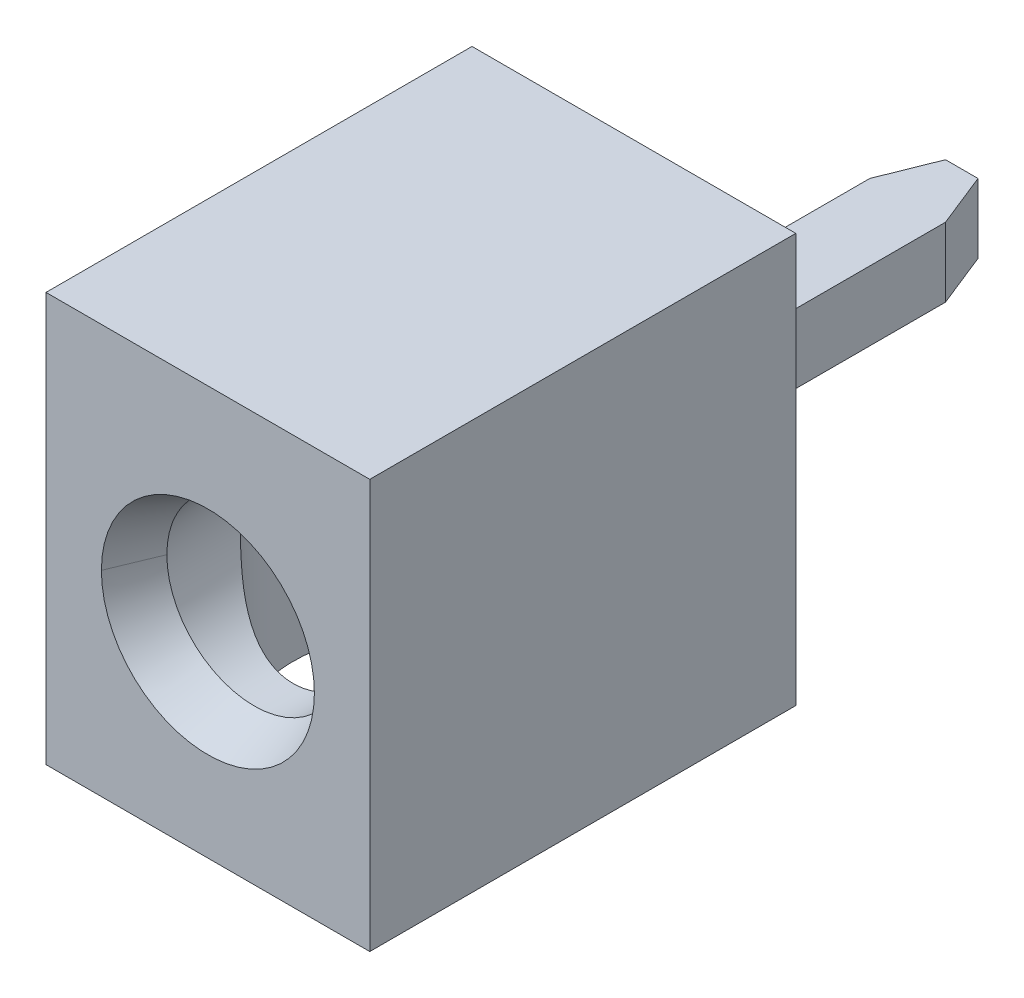
ISO-10303-21;
HEADER;
FILE_DESCRIPTION(('STEP AP214'),'2;1');
FILE_NAME('part.step','',(''),(''),'','','');
FILE_SCHEMA(('AUTOMOTIVE_DESIGN { 1 0 10303 214 1 1 1 1 }'));
ENDSEC;
DATA;
#1=APPLICATION_CONTEXT('core data for automotive mechanical design processes');
#2=APPLICATION_PROTOCOL_DEFINITION('international standard','automotive_design',2000,#1);
#3=PRODUCT_CONTEXT('',#1,'mechanical');
#4=PRODUCT('Part','Part','',(#3));
#5=PRODUCT_RELATED_PRODUCT_CATEGORY('part','',(#4));
#6=PRODUCT_DEFINITION_FORMATION('','',#4);
#7=PRODUCT_DEFINITION_CONTEXT('part definition',#1,'design');
#8=PRODUCT_DEFINITION('design','',#6,#7);
#9=PRODUCT_DEFINITION_SHAPE('','',#8);
#10=(LENGTH_UNIT() NAMED_UNIT(*) SI_UNIT(.MILLI.,.METRE.));
#11=(NAMED_UNIT(*) PLANE_ANGLE_UNIT() SI_UNIT($,.RADIAN.));
#12=(NAMED_UNIT(*) SI_UNIT($,.STERADIAN.) SOLID_ANGLE_UNIT());
#13=UNCERTAINTY_MEASURE_WITH_UNIT(LENGTH_MEASURE(1.E-05),#10,'distance_accuracy_value','');
#14=(GEOMETRIC_REPRESENTATION_CONTEXT(3) GLOBAL_UNCERTAINTY_ASSIGNED_CONTEXT((#13)) GLOBAL_UNIT_ASSIGNED_CONTEXT((#10,
#11,#12)) REPRESENTATION_CONTEXT('',''));
#15=CARTESIAN_POINT('',(0.,0.,0.));
#16=DIRECTION('',(0.,0.,1.));
#17=DIRECTION('',(1.,0.,0.));
#18=AXIS2_PLACEMENT_3D('',#15,#16,#17);
#19=CARTESIAN_POINT('',(4.6355,-0.4064,0.8));
#20=DIRECTION('',(0.,1.,0.));
#21=DIRECTION('',(0.,0.,1.));
#22=AXIS2_PLACEMENT_3D('',#19,#20,#21);
#23=PLANE('',#22);
#24=DIRECTION('',(1.,0.,0.));
#25=VECTOR('',#24,1.);
#26=CARTESIAN_POINT('',(4.6355,-0.4064,-3.0479999993));
#27=LINE('',#26,#25);
#28=CARTESIAN_POINT('',(5.27049999977621,-0.4064,-3.04799999968448));
#29=VERTEX_POINT('',#28);
#30=CARTESIAN_POINT('',(4.88950000045741,-0.4064,-3.04799999955603));
#31=VERTEX_POINT('',#30);
#32=EDGE_CURVE('E240',#29,#31,#27,.F.);
#33=ORIENTED_EDGE('',*,*,#32,.F.);
#34=DIRECTION('',(-0.371390677284344,0.,-0.928476690513163));
#35=VECTOR('',#34,1.);
#36=CARTESIAN_POINT('',(5.52450000043,-0.4064,-2.41299999952));
#37=LINE('',#36,#35);
#38=CARTESIAN_POINT('',(5.52449999988621,-0.4064,-2.41300000058198));
#39=VERTEX_POINT('',#38);
#40=EDGE_CURVE('E242',#39,#29,#37,.T.);
#41=ORIENTED_EDGE('',*,*,#40,.F.);
#42=DIRECTION('',(0.,0.,1.));
#43=VECTOR('',#42,1.);
#44=CARTESIAN_POINT('',(5.5245,-0.4064,0.8));
#45=LINE('',#44,#43);
#46=CARTESIAN_POINT('',(5.524499999745,-0.4063999997855,0.8));
#47=VERTEX_POINT('',#46);
#48=EDGE_CURVE('E229',#39,#47,#45,.T.);
#49=ORIENTED_EDGE('',*,*,#48,.T.);
#50=DIRECTION('',(1.,0.,0.));
#51=VECTOR('',#50,1.);
#52=CARTESIAN_POINT('',(4.6355,-0.4064,0.8));
#53=LINE('',#52,#51);
#54=CARTESIAN_POINT('',(4.635499999615,-0.4063999993565,0.8));
#55=VERTEX_POINT('',#54);
#56=EDGE_CURVE('E244',#55,#47,#53,.T.);
#57=ORIENTED_EDGE('',*,*,#56,.F.);
#58=DIRECTION('',(0.,0.,-1.));
#59=VECTOR('',#58,1.);
#60=CARTESIAN_POINT('',(4.6355,-0.406399999142,0.8));
#61=LINE('',#60,#59);
#62=CARTESIAN_POINT('',(4.63549999995862,-0.4063999997855,-2.41299999953655));
#63=VERTEX_POINT('',#62);
#64=EDGE_CURVE('E222',#55,#63,#61,.T.);
#65=ORIENTED_EDGE('',*,*,#64,.T.);
#66=DIRECTION('',(-0.37139067729695,0.,0.928476690508121));
#67=VECTOR('',#66,1.);
#68=CARTESIAN_POINT('',(4.88950000066,-0.4064,-3.0479999993));
#69=LINE('',#68,#67);
#70=EDGE_CURVE('E232',#31,#63,#69,.T.);
#71=ORIENTED_EDGE('',*,*,#70,.F.);
#72=EDGE_LOOP('',(#33,#41,#49,#57,#65,#71));
#73=FACE_BOUND('',#72,.T.);
#74=ADVANCED_FACE('F17',(#73),#23,.F.);
#75=CARTESIAN_POINT('',(5.08,0.127,4.38111140383));
#76=DIRECTION('',(0.,0.,1.));
#77=DIRECTION('',(1.,0.,0.));
#78=AXIS2_PLACEMENT_3D('',#75,#76,#77);
#79=CYLINDRICAL_SURFACE('',#78,1.025);
#80=CARTESIAN_POINT('',(5.08,0.127,5.25680194840561));
#81=DIRECTION('',(0.,0.,1.));
#82=DIRECTION('',(-1.,0.,0.));
#83=AXIS2_PLACEMENT_3D('',#80,#81,#82);
#84=CIRCLE('',#83,1.02500000000608);
#85=CARTESIAN_POINT('',(4.05500000012002,0.127,5.25680194801091));
#86=VERTEX_POINT('',#85);
#87=CARTESIAN_POINT('',(6.10499999988329,0.127,5.25680194801091));
#88=VERTEX_POINT('',#87);
#89=EDGE_CURVE('E114',#86,#88,#84,.T.);
#90=ORIENTED_EDGE('',*,*,#89,.T.);
#91=CARTESIAN_POINT('',(5.08,0.127,5.25680194789402));
#92=DIRECTION('',(0.,0.,1.));
#93=DIRECTION('',(1.,0.,0.));
#94=AXIS2_PLACEMENT_3D('',#91,#92,#93);
#95=CIRCLE('',#94,1.02499999976355);
#96=EDGE_CURVE('E117',#88,#86,#95,.T.);
#97=ORIENTED_EDGE('',*,*,#96,.T.);
#98=EDGE_LOOP('',(#90,#97));
#99=FACE_BOUND('',#98,.T.);
#100=CARTESIAN_POINT('',(5.08,1.152,4.8));
#101=CARTESIAN_POINT('',(5.13124190339614,1.15200218663796,4.80000200455833));
#102=CARTESIAN_POINT('',(5.18247242123001,1.14813763936166,4.79735295131062));
#103=CARTESIAN_POINT('',(5.28328879117383,1.13293169384138,4.78702471947178));
#104=CARTESIAN_POINT('',(5.3328741311379,1.12158798984372,4.77934398966676));
#105=CARTESIAN_POINT('',(5.42879345355356,1.09213039350657,4.75970281738489));
#106=CARTESIAN_POINT('',(5.47514159337119,1.07404850085224,4.74776261443114));
#107=CARTESIAN_POINT('',(5.56394126664379,1.03190002060215,4.72054931528331));
#108=CARTESIAN_POINT('',(5.60639220645401,1.0078325233075,4.70527571251865));
#109=CARTESIAN_POINT('',(5.69034992404368,0.952137908514625,4.67102244704643));
#110=CARTESIAN_POINT('',(5.73145591536452,0.920036354592225,4.65183630077378));
#111=CARTESIAN_POINT('',(5.80807199292676,0.850341817317325,4.61216496818223));
#112=CARTESIAN_POINT('',(5.84357390237147,0.812740961264762,4.59167794374893));
#113=CARTESIAN_POINT('',(5.91403871543853,0.725863854522093,4.54754897159383));
#114=CARTESIAN_POINT('',(5.94792515915416,0.675686205005853,4.52395042437529));
#115=CARTESIAN_POINT('',(6.006783423147,0.569031282974823,4.48000903906691));
#116=CARTESIAN_POINT('',(6.03176748088034,0.512562799358778,4.45966175310859));
#117=CARTESIAN_POINT('',(6.06567225546744,0.411634145691861,4.43083685779336));
#118=CARTESIAN_POINT('',(6.07715656869037,0.368532160793004,4.42062833861311));
#119=CARTESIAN_POINT('',(6.09443484613666,0.280436309248441,4.40501761953886));
#120=CARTESIAN_POINT('',(6.10024933443958,0.235449885729025,4.39959809081512));
#121=CARTESIAN_POINT('',(6.10435175330565,0.169161430900103,4.39576549942505));
#122=CARTESIAN_POINT('',(6.10500339246293,0.148088091008707,4.39515402347627));
#123=CARTESIAN_POINT('',(6.1049920291387,0.0774533200625724,4.39517339095806));
#124=CARTESIAN_POINT('',(6.10136815432921,0.0278252110506045,4.39859436278961));
#125=CARTESIAN_POINT('',(6.08717247902842,-0.069668129083675,4.4116144120993));
#126=CARTESIAN_POINT('',(6.07657604676577,-0.117526472790981,4.42123538967884));
#127=CARTESIAN_POINT('',(6.04931072305068,-0.209670091258928,4.44488228623414));
#128=CARTESIAN_POINT('',(6.03270902292723,-0.253988523017086,4.4588592367443));
#129=CARTESIAN_POINT('',(5.99408673874807,-0.339108627995141,4.48956014326405));
#130=CARTESIAN_POINT('',(5.97206708659348,-0.379910904374533,4.50628362669886));
#131=CARTESIAN_POINT('',(5.91900527159578,-0.464244998328918,4.54390262065413));
#132=CARTESIAN_POINT('',(5.88707339587137,-0.507113378117154,4.56503084532318));
#133=CARTESIAN_POINT('',(5.81689057082023,-0.587469312597153,4.60716185416365));
#134=CARTESIAN_POINT('',(5.77863247401983,-0.624950690392204,4.6281644682851));
#135=CARTESIAN_POINT('',(5.68974089744101,-0.69925334487878,4.67150384783364));
#136=CARTESIAN_POINT('',(5.63810835771328,-0.735071185159345,4.69354255303367));
#137=CARTESIAN_POINT('',(5.52775791944053,-0.797191134476046,4.73280368733783));
#138=CARTESIAN_POINT('',(5.46904990071108,-0.823506311819147,4.75003272336114));
#139=CARTESIAN_POINT('',(5.35570916747904,-0.861744685551522,4.77540537406585));
#140=CARTESIAN_POINT('',(5.30183855245638,-0.875258977065505,4.78453883098506));
#141=CARTESIAN_POINT('',(5.19197245858668,-0.893380444479866,4.79683169860646));
#142=CARTESIAN_POINT('',(5.1359794352076,-0.897997611197969,4.79999781011163));
#143=CARTESIAN_POINT('',(5.02875809660353,-0.898002186638048,4.80000200455842));
#144=CARTESIAN_POINT('',(4.97752757876979,-0.894137639361675,4.79735295131063));
#145=CARTESIAN_POINT('',(4.87671120882613,-0.878931693841328,4.78702471947173));
#146=CARTESIAN_POINT('',(4.82712586886206,-0.867587989843692,4.77934398966674));
#147=CARTESIAN_POINT('',(4.73120654644619,-0.838130393506504,4.75970281738485));
#148=CARTESIAN_POINT('',(4.68485840662837,-0.820048500852071,4.74776261443103));
#149=CARTESIAN_POINT('',(4.59605873335582,-0.777900020601924,4.72054931528317));
#150=CARTESIAN_POINT('',(4.55360779354582,-0.753832523307372,4.70527571251857));
#151=CARTESIAN_POINT('',(4.46965007595687,-0.698137908515003,4.67102244704668));
#152=CARTESIAN_POINT('',(4.42854408463647,-0.66603635459306,4.65183630077431));
#153=CARTESIAN_POINT('',(4.35192800707424,-0.596341817318302,4.61216496818273));
#154=CARTESIAN_POINT('',(4.31642609762925,-0.558740961265282,4.59167794374906));
#155=CARTESIAN_POINT('',(4.24596128456003,-0.471863854520731,4.5475489715933));
#156=CARTESIAN_POINT('',(4.2120748408425,-0.421686205002934,4.52395042437454));
#157=CARTESIAN_POINT('',(4.15321657685289,-0.315031282971513,4.48000903906509));
#158=CARTESIAN_POINT('',(4.12823251912418,-0.258562799357004,4.45966175310573));
#159=CARTESIAN_POINT('',(4.09432774453204,-0.157634145701043,4.43083685779765));
#160=CARTESIAN_POINT('',(4.08284343130308,-0.114532160811997,4.42062833862296));
#161=CARTESIAN_POINT('',(4.06556515388064,-0.0264363092843876,4.40501761953878));
#162=CARTESIAN_POINT('',(4.05975066560786,0.0185501142280324,4.39959809079994));
#163=CARTESIAN_POINT('',(4.05564824666031,0.0848385693140517,4.39576549942085));
#164=CARTESIAN_POINT('',(4.05499660746637,0.105911909471277,4.39515402348749));
#165=CARTESIAN_POINT('',(4.05500797079141,0.176546680707779,4.39517339104091));
#166=CARTESIAN_POINT('',(4.05863184571804,0.226174789739192,4.39859436287364));
#167=CARTESIAN_POINT('',(4.07282752115976,0.323668129907485,4.4116144122312));
#168=CARTESIAN_POINT('',(4.08342395344643,0.37152647362917,4.42123538985809));
#169=CARTESIAN_POINT('',(4.11068927723814,0.463670092115128,4.44488228648942));
#170=CARTESIAN_POINT('',(4.12729097741365,0.507988523877119,4.4588592370283));
#171=CARTESIAN_POINT('',(4.16591326169109,0.5931086288541,4.48956014360011));
#172=CARTESIAN_POINT('',(4.18793291389153,0.633910905228818,4.50628362705808));
#173=CARTESIAN_POINT('',(4.24099472900203,0.718244999181826,4.54390262106008));
#174=CARTESIAN_POINT('',(4.27292660479626,0.761113378970849,4.56503084575163));
#175=CARTESIAN_POINT('',(4.34310942999559,0.841469313441826,4.60716185462564));
#176=CARTESIAN_POINT('',(4.38136752687462,0.878950691226857,4.62816446875814));
#177=CARTESIAN_POINT('',(4.47025910359098,0.953253345640972,4.67150384829416));
#178=CARTESIAN_POINT('',(4.52189164337219,0.989071185863044,4.69354255346999));
#179=CARTESIAN_POINT('',(4.63224208174251,1.05119113504977,4.73280368770884));
#180=CARTESIAN_POINT('',(4.69095010051576,1.07750631232179,4.75003272369124));
#181=CARTESIAN_POINT('',(4.80429083360292,1.11574468584145,4.77540537426109));
#182=CARTESIAN_POINT('',(4.85816144842389,1.12925897724783,4.78453883110839));
#183=CARTESIAN_POINT('',(4.96802754186542,1.14738044451743,4.79683169863231));
#184=CARTESIAN_POINT('',(5.02402056501811,1.15199761119808,4.79999781011174));
#185=CARTESIAN_POINT('',(5.08,1.152,4.8));
#186=B_SPLINE_CURVE_WITH_KNOTS('',3,(#100,#101,#102,#103,#104,#105,#106,#107,#108,#109,#110,
#111,#112,#113,#114,#115,#116,#117,#118,#119,#120,#121,#122,#123,#124,#125,#126,#127,#128,#129,
#130,#131,#132,#133,#134,#135,#136,#137,#138,#139,#140,#141,#142,#143,#144,#145,#146,#147,#148,
#149,#150,#151,#152,#153,#154,#155,#156,#157,#158,#159,#160,#161,#162,#163,#164,#165,#166,#167,
#168,#169,#170,#171,#172,#173,#174,#175,#176,#177,#178,#179,#180,#181,#182,#183,#184,#185),
.UNSPECIFIED.,.T.,.F.,(4,2,2,2,2,2,2,2,2,2,2,2,2,2,2,2,2,2,2,2,2,2,2,2,2,2,2,2,2,2,2,2,2,2,2,2,
2,2,2,2,2,2,4),(0.,0.153500918855325,0.307049182741793,0.459877350273038,0.612728759009499,
0.778829229402621,0.945169856916163,1.13924012538037,1.33304258107341,1.46979659833109,
1.6060537243528,1.66928199421822,1.81783744424573,1.96692053019654,2.11438469959819,
2.26182352250775,2.43363050027816,2.60563293170866,2.80430457228047,3.00270194452341,
3.17058330444543,3.33827603581985,3.49177695467537,3.64532521856165,3.79815338609361,
3.95100479482935,4.11710526522032,4.28344589273602,4.47751616120587,4.67131861689327,
4.80807263412099,4.94432976012255,5.00755803078391,5.15611348088936,5.30519656693049,
5.45266073641646,5.60009955940064,5.7719065373122,5.94390896889021,6.14258060946665,
6.3409779817063,6.50885934094821,6.67655207164741),.UNSPECIFIED.);
#187=CARTESIAN_POINT('',(5.08,1.152,4.8));
#188=VERTEX_POINT('',#187);
#189=EDGE_CURVE('E20',#188,#188,#186,.T.);
#190=ORIENTED_EDGE('',*,*,#189,.T.);
#191=EDGE_LOOP('',(#190));
#192=FACE_BOUND('',#191,.T.);
#193=ADVANCED_FACE('F144',(#99,#192),#79,.F.);
#194=CARTESIAN_POINT('',(5.08,2.327,3.3));
#195=DIRECTION('',(0.,1.,0.));
#196=DIRECTION('',(0.,0.,1.));
#197=AXIS2_PLACEMENT_3D('',#194,#195,#196);
#198=PLANE('',#197);
#199=CARTESIAN_POINT('',(5.08,2.327,3.3));
#200=DIRECTION('',(0.,-1.,0.));
#201=DIRECTION('',(0.,0.,-1.));
#202=AXIS2_PLACEMENT_3D('',#199,#200,#201);
#203=CIRCLE('',#202,1.5);
#204=CARTESIAN_POINT('',(5.08,2.327,1.8));
#205=VERTEX_POINT('',#204);
#206=EDGE_CURVE('E133',#205,#205,#203,.T.);
#207=ORIENTED_EDGE('',*,*,#206,.T.);
#208=EDGE_LOOP('',(#207));
#209=FACE_BOUND('',#208,.T.);
#210=ADVANCED_FACE('F310',(#209),#198,.F.);
#211=CARTESIAN_POINT('',(5.5245,-0.4064,0.8));
#212=DIRECTION('',(-1.,0.,0.));
#213=DIRECTION('',(0.,0.,1.));
#214=AXIS2_PLACEMENT_3D('',#211,#212,#213);
#215=PLANE('',#214);
#216=DIRECTION('',(0.,0.,-1.));
#217=VECTOR('',#216,1.);
#218=CARTESIAN_POINT('',(5.5245,0.4064,0.8));
#219=LINE('',#218,#217);
#220=CARTESIAN_POINT('',(5.52450000005621,0.406400000047,-2.41299999985948));
#221=VERTEX_POINT('',#220);
#222=CARTESIAN_POINT('',(5.524499999915,0.40640000026175,0.8));
#223=VERTEX_POINT('',#222);
#224=EDGE_CURVE('E135',#221,#223,#219,.F.);
#225=ORIENTED_EDGE('',*,*,#224,.T.);
#226=DIRECTION('',(0.,1.,0.));
#227=VECTOR('',#226,1.);
#228=CARTESIAN_POINT('',(5.5245,-0.4064,0.8));
#229=LINE('',#228,#227);
#230=EDGE_CURVE('E227',#47,#223,#229,.T.);
#231=ORIENTED_EDGE('',*,*,#230,.F.);
#232=ORIENTED_EDGE('',*,*,#48,.F.);
#233=DIRECTION('',(0.,1.,0.));
#234=VECTOR('',#233,1.);
#235=CARTESIAN_POINT('',(5.52450000022483,-0.4064,-2.41299999943793));
#236=LINE('',#235,#234);
#237=EDGE_CURVE('E213',#39,#221,#236,.T.);
#238=ORIENTED_EDGE('',*,*,#237,.T.);
#239=EDGE_LOOP('',(#225,#231,#232,#238));
#240=FACE_BOUND('',#239,.T.);
#241=ADVANCED_FACE('F292',(#240),#215,.F.);
#242=CARTESIAN_POINT('',(4.6355,0.4064,0.8));
#243=DIRECTION('',(1.,0.,0.));
#244=DIRECTION('',(0.,0.,-1.));
#245=AXIS2_PLACEMENT_3D('',#242,#243,#244);
#246=PLANE('',#245);
#247=ORIENTED_EDGE('',*,*,#64,.F.);
#248=DIRECTION('',(0.,1.,0.));
#249=VECTOR('',#248,1.);
#250=CARTESIAN_POINT('',(4.6355,0.4064,0.8));
#251=LINE('',#250,#249);
#252=CARTESIAN_POINT('',(4.635499999615,0.40640000008725,0.8));
#253=VERTEX_POINT('',#252);
#254=EDGE_CURVE('E225',#253,#55,#251,.F.);
#255=ORIENTED_EDGE('',*,*,#254,.F.);
#256=DIRECTION('',(0.,0.,-1.));
#257=VECTOR('',#256,1.);
#258=CARTESIAN_POINT('',(4.63549999923,0.4064,0.8));
#259=LINE('',#258,#257);
#260=CARTESIAN_POINT('',(4.63549999976612,0.4063999998725,-2.4129999990553));
#261=VERTEX_POINT('',#260);
#262=EDGE_CURVE('E139',#253,#261,#259,.T.);
#263=ORIENTED_EDGE('',*,*,#262,.T.);
#264=DIRECTION('',(0.,1.,0.));
#265=VECTOR('',#264,1.);
#266=CARTESIAN_POINT('',(4.63549999983448,-0.4064,-2.41299999958621));
#267=LINE('',#266,#265);
#268=EDGE_CURVE('E219',#261,#63,#267,.F.);
#269=ORIENTED_EDGE('',*,*,#268,.T.);
#270=EDGE_LOOP('',(#247,#255,#263,#269));
#271=FACE_BOUND('',#270,.T.);
#272=ADVANCED_FACE('F282',(#271),#246,.F.);
#273=CARTESIAN_POINT('',(4.8895,-0.4064,-3.048));
#274=DIRECTION('',(0.928476690885259,0.,0.371390676354104));
#275=DIRECTION('',(0.371390676354104,0.,-0.928476690885259));
#276=AXIS2_PLACEMENT_3D('',#273,#274,#275);
#277=PLANE('',#276);
#278=DIRECTION('',(0.371390676112089,0.,-0.928476690982065));
#279=VECTOR('',#278,1.);
#280=CARTESIAN_POINT('',(4.6355,0.4064,-2.41299999952));
#281=LINE('',#280,#279);
#282=CARTESIAN_POINT('',(4.88950000008983,0.4063999996175,-3.04799999981207));
#283=VERTEX_POINT('',#282);
#284=EDGE_CURVE('E193',#261,#283,#281,.T.);
#285=ORIENTED_EDGE('',*,*,#284,.T.);
#286=DIRECTION('',(0.,1.,0.));
#287=VECTOR('',#286,1.);
#288=CARTESIAN_POINT('',(4.88950000066,-0.381,-3.048));
#289=LINE('',#288,#287);
#290=EDGE_CURVE('E217',#31,#283,#289,.T.);
#291=ORIENTED_EDGE('',*,*,#290,.F.);
#292=ORIENTED_EDGE('',*,*,#70,.T.);
#293=ORIENTED_EDGE('',*,*,#268,.F.);
#294=EDGE_LOOP('',(#285,#291,#292,#293));
#295=FACE_BOUND('',#294,.T.);
#296=ADVANCED_FACE('F284',(#295),#277,.F.);
#297=CARTESIAN_POINT('',(2.54,-0.381,-3.048));
#298=DIRECTION('',(0.,0.,-1.));
#299=DIRECTION('',(0.,1.,0.));
#300=AXIS2_PLACEMENT_3D('',#297,#298,#299);
#301=PLANE('',#300);
#302=DIRECTION('',(1.,0.,0.));
#303=VECTOR('',#302,1.);
#304=CARTESIAN_POINT('',(5.5245,0.4064,-3.048));
#305=LINE('',#304,#303);
#306=CARTESIAN_POINT('',(5.27049999968621,0.4063999996175,-3.04800000003448));
#307=VERTEX_POINT('',#306);
#308=EDGE_CURVE('E191',#283,#307,#305,.T.);
#309=ORIENTED_EDGE('',*,*,#308,.T.);
#310=DIRECTION('',(0.,1.,0.));
#311=VECTOR('',#310,1.);
#312=CARTESIAN_POINT('',(5.27049999994483,-0.4064,-3.04800000013793));
#313=LINE('',#312,#311);
#314=EDGE_CURVE('E215',#307,#29,#313,.F.);
#315=ORIENTED_EDGE('',*,*,#314,.T.);
#316=ORIENTED_EDGE('',*,*,#32,.T.);
#317=ORIENTED_EDGE('',*,*,#290,.T.);
#318=EDGE_LOOP('',(#309,#315,#316,#317));
#319=FACE_BOUND('',#318,.T.);
#320=ADVANCED_FACE('F295',(#319),#301,.T.);
#321=CARTESIAN_POINT('',(5.5245,-0.4064,-2.413));
#322=DIRECTION('',(-0.928476690885259,0.,0.371390676354104));
#323=DIRECTION('',(0.371390676354104,0.,0.928476690885259));
#324=AXIS2_PLACEMENT_3D('',#321,#322,#323);
#325=PLANE('',#324);
#326=ORIENTED_EDGE('',*,*,#40,.T.);
#327=ORIENTED_EDGE('',*,*,#314,.F.);
#328=DIRECTION('',(0.371390676858299,0.,0.928476690683581));
#329=VECTOR('',#328,1.);
#330=CARTESIAN_POINT('',(5.2704999996,0.4064,-3.048));
#331=LINE('',#330,#329);
#332=EDGE_CURVE('E196',#307,#221,#331,.T.);
#333=ORIENTED_EDGE('',*,*,#332,.T.);
#334=ORIENTED_EDGE('',*,*,#237,.F.);
#335=EDGE_LOOP('',(#326,#327,#333,#334));
#336=FACE_BOUND('',#335,.T.);
#337=ADVANCED_FACE('F294',(#336),#325,.F.);
#338=CARTESIAN_POINT('',(5.08,0.127,5.80000000002201));
#339=DIRECTION('',(0.,0.,1.));
#340=DIRECTION('',(1.,0.,0.));
#341=AXIS2_PLACEMENT_3D('',#338,#339,#340);
#342=CONICAL_SURFACE('',#341,1.25000000003486,0.392699081690289);
#343=DIRECTION('',(0.382683432365345,0.,-0.923879532511181));
#344=VECTOR('',#343,1.);
#345=CARTESIAN_POINT('',(-206686.335185674,0.127000000025312,499000.));
#346=LINE('',#345,#344);
#347=CARTESIAN_POINT('',(3.82999999999071,0.127,5.80000000002201));
#348=VERTEX_POINT('',#347);
#349=EDGE_CURVE('E111',#86,#348,#346,.F.);
#350=ORIENTED_EDGE('',*,*,#349,.T.);
#351=CARTESIAN_POINT('',(5.08,0.127,5.80000000002201));
#352=DIRECTION('',(0.,0.,1.));
#353=DIRECTION('',(1.,0.,0.));
#354=AXIS2_PLACEMENT_3D('',#351,#352,#353);
#355=CIRCLE('',#354,1.25000000003486);
#356=CARTESIAN_POINT('',(6.33000000003107,0.127,5.80000000002201));
#357=VERTEX_POINT('',#356);
#358=EDGE_CURVE('E107',#357,#348,#355,.F.);
#359=ORIENTED_EDGE('',*,*,#358,.F.);
#360=DIRECTION('',(-0.382683432365345,0.,-0.923879532511181));
#361=VECTOR('',#360,1.);
#362=CARTESIAN_POINT('',(206696.495185674,0.127,499000.));
#363=LINE('',#362,#361);
#364=EDGE_CURVE('E122',#357,#88,#363,.T.);
#365=ORIENTED_EDGE('',*,*,#364,.T.);
#366=ORIENTED_EDGE('',*,*,#89,.F.);
#367=EDGE_LOOP('',(#350,#359,#365,#366));
#368=FACE_BOUND('',#367,.T.);
#369=ADVANCED_FACE('F113',(#368),#342,.F.);
#370=CARTESIAN_POINT('',(5.08,0.127,5.80000000002201));
#371=DIRECTION('',(0.,0.,1.));
#372=DIRECTION('',(1.,0.,0.));
#373=AXIS2_PLACEMENT_3D('',#370,#371,#372);
#374=CONICAL_SURFACE('',#373,1.25000000001971,0.392699081714591);
#375=ORIENTED_EDGE('',*,*,#96,.F.);
#376=ORIENTED_EDGE('',*,*,#364,.F.);
#377=CARTESIAN_POINT('',(5.08,0.127,5.80000000002201));
#378=DIRECTION('',(0.,0.,1.));
#379=DIRECTION('',(1.,0.,0.));
#380=AXIS2_PLACEMENT_3D('',#377,#378,#379);
#381=CIRCLE('',#380,1.25000000001971);
#382=EDGE_CURVE('E120',#348,#357,#381,.F.);
#383=ORIENTED_EDGE('',*,*,#382,.F.);
#384=ORIENTED_EDGE('',*,*,#349,.F.);
#385=EDGE_LOOP('',(#375,#376,#383,#384));
#386=FACE_BOUND('',#385,.T.);
#387=ADVANCED_FACE('F121',(#386),#374,.F.);
#388=CARTESIAN_POINT('',(5.08,2.327,3.3));
#389=DIRECTION('',(0.,-1.,0.));
#390=DIRECTION('',(0.,0.,-1.));
#391=AXIS2_PLACEMENT_3D('',#388,#389,#390);
#392=CYLINDRICAL_SURFACE('',#391,1.5);
#393=CARTESIAN_POINT('',(5.08,-2.173,3.3));
#394=DIRECTION('',(0.,-1.,0.));
#395=DIRECTION('',(0.,0.,-1.));
#396=AXIS2_PLACEMENT_3D('',#393,#394,#395);
#397=CIRCLE('',#396,1.5);
#398=CARTESIAN_POINT('',(5.08,-2.173,1.8));
#399=VERTEX_POINT('',#398);
#400=EDGE_CURVE('E245',#399,#399,#397,.F.);
#401=ORIENTED_EDGE('',*,*,#400,.F.);
#402=EDGE_LOOP('',(#401));
#403=FACE_BOUND('',#402,.T.);
#404=ORIENTED_EDGE('',*,*,#206,.F.);
#405=EDGE_LOOP('',(#404));
#406=FACE_BOUND('',#405,.T.);
#407=ORIENTED_EDGE('',*,*,#189,.F.);
#408=EDGE_LOOP('',(#407));
#409=FACE_BOUND('',#408,.T.);
#410=ADVANCED_FACE('F146',(#403,#406,#409),#392,.F.);
#411=CARTESIAN_POINT('',(3.18,2.627,5.8));
#412=DIRECTION('',(-1.,0.,0.));
#413=DIRECTION('',(0.,0.,1.));
#414=AXIS2_PLACEMENT_3D('',#411,#412,#413);
#415=PLANE('',#414);
#416=DIRECTION('',(0.,0.,-1.));
#417=VECTOR('',#416,1.);
#418=CARTESIAN_POINT('',(3.18,-2.173,0.8));
#419=LINE('',#418,#417);
#420=CARTESIAN_POINT('',(3.179999999625,-2.173,5.8));
#421=VERTEX_POINT('',#420);
#422=CARTESIAN_POINT('',(3.18,-2.173,0.8));
#423=VERTEX_POINT('',#422);
#424=EDGE_CURVE('E248',#421,#423,#419,.T.);
#425=ORIENTED_EDGE('',*,*,#424,.F.);
#426=DIRECTION('',(0.,1.,0.));
#427=VECTOR('',#426,1.);
#428=CARTESIAN_POINT('',(3.17999999925,2.627,5.8));
#429=LINE('',#428,#427);
#430=CARTESIAN_POINT('',(3.1799999994375,2.627,5.8));
#431=VERTEX_POINT('',#430);
#432=EDGE_CURVE('E128',#431,#421,#429,.F.);
#433=ORIENTED_EDGE('',*,*,#432,.F.);
#434=DIRECTION('',(0.,0.,-1.));
#435=VECTOR('',#434,1.);
#436=CARTESIAN_POINT('',(3.17999999925,2.627,0.8));
#437=LINE('',#436,#435);
#438=CARTESIAN_POINT('',(3.179999999625,2.627,0.8));
#439=VERTEX_POINT('',#438);
#440=EDGE_CURVE('E202',#431,#439,#437,.T.);
#441=ORIENTED_EDGE('',*,*,#440,.T.);
#442=DIRECTION('',(0.,1.,0.));
#443=VECTOR('',#442,1.);
#444=CARTESIAN_POINT('',(3.18,2.627,0.8));
#445=LINE('',#444,#443);
#446=EDGE_CURVE('E262',#423,#439,#445,.T.);
#447=ORIENTED_EDGE('',*,*,#446,.F.);
#448=EDGE_LOOP('',(#425,#433,#441,#447));
#449=FACE_BOUND('',#448,.T.);
#450=ADVANCED_FACE('F148',(#449),#415,.T.);
#451=CARTESIAN_POINT('',(5.5245,0.4064,0.8));
#452=DIRECTION('',(0.,-1.,0.));
#453=DIRECTION('',(0.,0.,-1.));
#454=AXIS2_PLACEMENT_3D('',#451,#452,#453);
#455=PLANE('',#454);
#456=ORIENTED_EDGE('',*,*,#308,.F.);
#457=ORIENTED_EDGE('',*,*,#284,.F.);
#458=ORIENTED_EDGE('',*,*,#262,.F.);
#459=DIRECTION('',(-1.,0.,0.));
#460=VECTOR('',#459,1.);
#461=CARTESIAN_POINT('',(3.18,0.406400000349,0.8));
#462=LINE('',#461,#460);
#463=EDGE_CURVE('E266',#223,#253,#462,.T.);
#464=ORIENTED_EDGE('',*,*,#463,.F.);
#465=ORIENTED_EDGE('',*,*,#224,.F.);
#466=ORIENTED_EDGE('',*,*,#332,.F.);
#467=EDGE_LOOP('',(#456,#457,#458,#464,#465,#466));
#468=FACE_BOUND('',#467,.T.);
#469=ADVANCED_FACE('F155',(#468),#455,.F.);
#470=CARTESIAN_POINT('',(3.18,2.627,0.8));
#471=DIRECTION('',(0.,-1.,0.));
#472=DIRECTION('',(0.,0.,-1.));
#473=AXIS2_PLACEMENT_3D('',#470,#471,#472);
#474=PLANE('',#473);
#475=DIRECTION('',(0.,0.,-1.));
#476=VECTOR('',#475,1.);
#477=CARTESIAN_POINT('',(6.98,2.627,0.8));
#478=LINE('',#477,#476);
#479=CARTESIAN_POINT('',(6.98,2.627,0.8));
#480=VERTEX_POINT('',#479);
#481=CARTESIAN_POINT('',(6.9800000001875,2.627,5.8));
#482=VERTEX_POINT('',#481);
#483=EDGE_CURVE('E264',#480,#482,#478,.F.);
#484=ORIENTED_EDGE('',*,*,#483,.F.);
#485=DIRECTION('',(-1.,0.,0.));
#486=VECTOR('',#485,1.);
#487=CARTESIAN_POINT('',(3.18,2.627,0.8));
#488=LINE('',#487,#486);
#489=EDGE_CURVE('E247',#439,#480,#488,.F.);
#490=ORIENTED_EDGE('',*,*,#489,.F.);
#491=ORIENTED_EDGE('',*,*,#440,.F.);
#492=DIRECTION('',(1.,0.,0.));
#493=VECTOR('',#492,1.);
#494=CARTESIAN_POINT('',(6.98,2.627,5.8));
#495=LINE('',#494,#493);
#496=EDGE_CURVE('E130',#482,#431,#495,.F.);
#497=ORIENTED_EDGE('',*,*,#496,.F.);
#498=EDGE_LOOP('',(#484,#490,#491,#497));
#499=FACE_BOUND('',#498,.T.);
#500=ADVANCED_FACE('F180',(#499),#474,.F.);
#501=CARTESIAN_POINT('',(6.98,2.627,5.8));
#502=DIRECTION('',(0.,0.,1.));
#503=DIRECTION('',(1.,0.,0.));
#504=AXIS2_PLACEMENT_3D('',#501,#502,#503);
#505=PLANE('',#504);
#506=ORIENTED_EDGE('',*,*,#358,.T.);
#507=ORIENTED_EDGE('',*,*,#382,.T.);
#508=EDGE_LOOP('',(#506,#507));
#509=FACE_BOUND('',#508,.T.);
#510=DIRECTION('',(1.,0.,0.));
#511=VECTOR('',#510,1.);
#512=CARTESIAN_POINT('',(3.18,-2.173,5.8));
#513=LINE('',#512,#511);
#514=CARTESIAN_POINT('',(6.9800000005625,-2.173,5.8));
#515=VERTEX_POINT('',#514);
#516=EDGE_CURVE('E124',#515,#421,#513,.F.);
#517=ORIENTED_EDGE('',*,*,#516,.F.);
#518=DIRECTION('',(0.,1.,0.));
#519=VECTOR('',#518,1.);
#520=CARTESIAN_POINT('',(6.98,2.627,5.8));
#521=LINE('',#520,#519);
#522=EDGE_CURVE('E272',#482,#515,#521,.F.);
#523=ORIENTED_EDGE('',*,*,#522,.F.);
#524=ORIENTED_EDGE('',*,*,#496,.T.);
#525=ORIENTED_EDGE('',*,*,#432,.T.);
#526=EDGE_LOOP('',(#517,#523,#524,#525));
#527=FACE_BOUND('',#526,.T.);
#528=ADVANCED_FACE('F126',(#509,#527),#505,.T.);
#529=CARTESIAN_POINT('',(3.18,-2.173,0.8));
#530=DIRECTION('',(0.,-1.,0.));
#531=DIRECTION('',(0.,0.,-1.));
#532=AXIS2_PLACEMENT_3D('',#529,#530,#531);
#533=PLANE('',#532);
#534=ORIENTED_EDGE('',*,*,#400,.T.);
#535=EDGE_LOOP('',(#534));
#536=FACE_BOUND('',#535,.T.);
#537=ORIENTED_EDGE('',*,*,#424,.T.);
#538=DIRECTION('',(-1.,0.,0.));
#539=VECTOR('',#538,1.);
#540=CARTESIAN_POINT('',(3.18,-2.173,0.8));
#541=LINE('',#540,#539);
#542=CARTESIAN_POINT('',(6.980000000375,-2.173,0.8));
#543=VERTEX_POINT('',#542);
#544=EDGE_CURVE('E38',#543,#423,#541,.T.);
#545=ORIENTED_EDGE('',*,*,#544,.F.);
#546=DIRECTION('',(0.,0.,-1.));
#547=VECTOR('',#546,1.);
#548=CARTESIAN_POINT('',(6.98,-2.173,0.8));
#549=LINE('',#548,#547);
#550=EDGE_CURVE('E29',#515,#543,#549,.T.);
#551=ORIENTED_EDGE('',*,*,#550,.F.);
#552=ORIENTED_EDGE('',*,*,#516,.T.);
#553=EDGE_LOOP('',(#537,#545,#551,#552));
#554=FACE_BOUND('',#553,.T.);
#555=ADVANCED_FACE('F170',(#536,#554),#533,.T.);
#556=CARTESIAN_POINT('',(3.18,2.627,0.8));
#557=DIRECTION('',(0.,0.,-1.));
#558=DIRECTION('',(-1.,0.,0.));
#559=AXIS2_PLACEMENT_3D('',#556,#557,#558);
#560=PLANE('',#559);
#561=ORIENTED_EDGE('',*,*,#230,.T.);
#562=ORIENTED_EDGE('',*,*,#463,.T.);
#563=ORIENTED_EDGE('',*,*,#254,.T.);
#564=ORIENTED_EDGE('',*,*,#56,.T.);
#565=EDGE_LOOP('',(#561,#562,#563,#564));
#566=FACE_BOUND('',#565,.T.);
#567=ORIENTED_EDGE('',*,*,#544,.T.);
#568=ORIENTED_EDGE('',*,*,#446,.T.);
#569=ORIENTED_EDGE('',*,*,#489,.T.);
#570=DIRECTION('',(0.,1.,0.));
#571=VECTOR('',#570,1.);
#572=CARTESIAN_POINT('',(6.98,2.627,0.8));
#573=LINE('',#572,#571);
#574=EDGE_CURVE('E11',#543,#480,#573,.T.);
#575=ORIENTED_EDGE('',*,*,#574,.F.);
#576=EDGE_LOOP('',(#567,#568,#569,#575));
#577=FACE_BOUND('',#576,.T.);
#578=ADVANCED_FACE('F164',(#566,#577),#560,.T.);
#579=CARTESIAN_POINT('',(6.98,2.627,0.8));
#580=DIRECTION('',(1.,0.,0.));
#581=DIRECTION('',(0.,0.,-1.));
#582=AXIS2_PLACEMENT_3D('',#579,#580,#581);
#583=PLANE('',#582);
#584=ORIENTED_EDGE('',*,*,#550,.T.);
#585=ORIENTED_EDGE('',*,*,#574,.T.);
#586=ORIENTED_EDGE('',*,*,#483,.T.);
#587=ORIENTED_EDGE('',*,*,#522,.T.);
#588=EDGE_LOOP('',(#584,#585,#586,#587));
#589=FACE_BOUND('',#588,.T.);
#590=ADVANCED_FACE('F162',(#589),#583,.T.);
#591=CLOSED_SHELL('',(#74,#193,#210,#241,#272,#296,#320,#337,#369,#387,#410,#450,#469,#500,#528,
#555,#578,#590));
#592=MANIFOLD_SOLID_BREP('B1',#591);
#593=ADVANCED_BREP_SHAPE_REPRESENTATION('',(#18,#592),#14);
#594=SHAPE_DEFINITION_REPRESENTATION(#9,#593);
ENDSEC;
END-ISO-10303-21;
